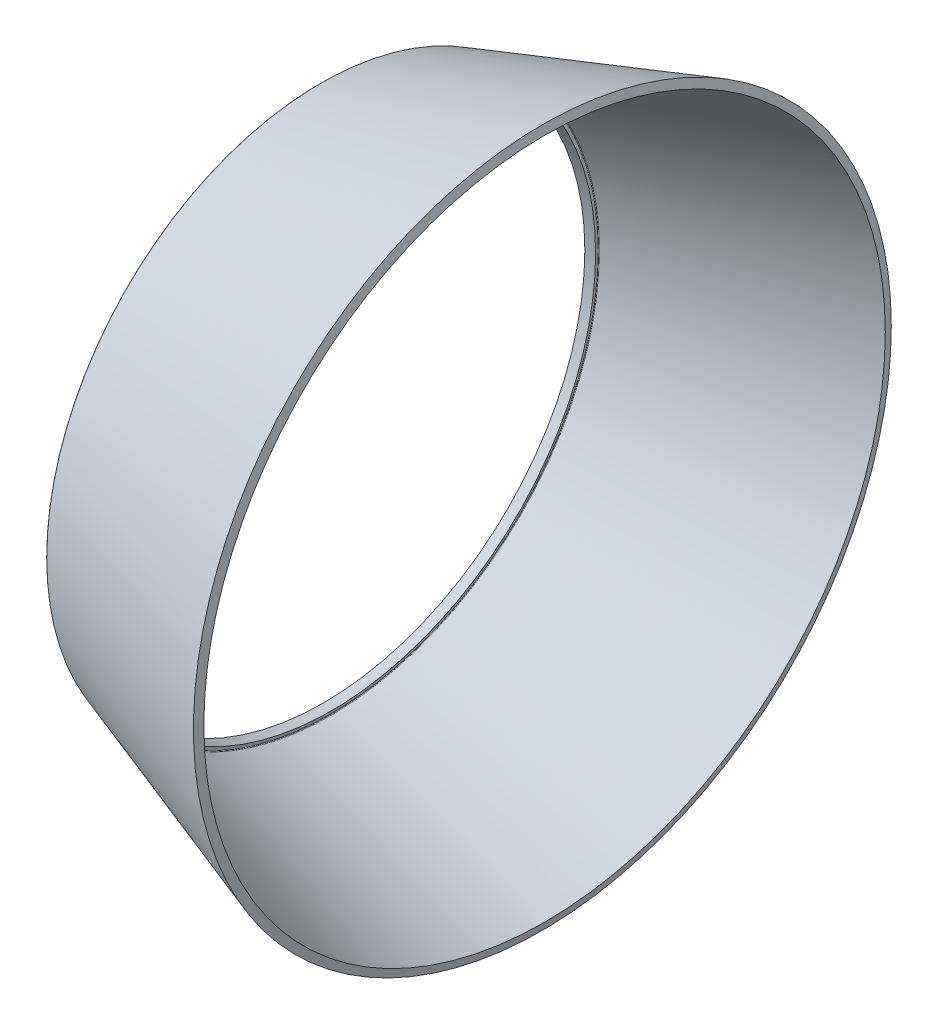
ISO-10303-21;
HEADER;
FILE_DESCRIPTION(('STEP AP214'),'2;1');
FILE_NAME('part.step','',(''),(''),'','','');
FILE_SCHEMA(('AUTOMOTIVE_DESIGN { 1 0 10303 214 1 1 1 1 }'));
ENDSEC;
DATA;
#1=APPLICATION_CONTEXT('core data for automotive mechanical design processes');
#2=APPLICATION_PROTOCOL_DEFINITION('international standard','automotive_design',2000,#1);
#3=PRODUCT_CONTEXT('',#1,'mechanical');
#4=PRODUCT('Part','Part','',(#3));
#5=PRODUCT_RELATED_PRODUCT_CATEGORY('part','',(#4));
#6=PRODUCT_DEFINITION_FORMATION('','',#4);
#7=PRODUCT_DEFINITION_CONTEXT('part definition',#1,'design');
#8=PRODUCT_DEFINITION('design','',#6,#7);
#9=PRODUCT_DEFINITION_SHAPE('','',#8);
#10=(LENGTH_UNIT() NAMED_UNIT(*) SI_UNIT(.MILLI.,.METRE.));
#11=(NAMED_UNIT(*) PLANE_ANGLE_UNIT() SI_UNIT($,.RADIAN.));
#12=(NAMED_UNIT(*) SI_UNIT($,.STERADIAN.) SOLID_ANGLE_UNIT());
#13=UNCERTAINTY_MEASURE_WITH_UNIT(LENGTH_MEASURE(1.E-05),#10,'distance_accuracy_value','');
#14=(GEOMETRIC_REPRESENTATION_CONTEXT(3) GLOBAL_UNCERTAINTY_ASSIGNED_CONTEXT((#13)) GLOBAL_UNIT_ASSIGNED_CONTEXT((#10,
#11,#12)) REPRESENTATION_CONTEXT('',''));
#15=CARTESIAN_POINT('',(0.,0.,0.));
#16=DIRECTION('',(0.,0.,1.));
#17=DIRECTION('',(1.,0.,0.));
#18=AXIS2_PLACEMENT_3D('',#15,#16,#17);
#19=CARTESIAN_POINT('',(0.397727850740168,0.,0.));
#20=DIRECTION('',(-1.,0.,0.));
#21=DIRECTION('',(0.,0.,1.));
#22=AXIS2_PLACEMENT_3D('',#19,#20,#21);
#23=CONICAL_SURFACE('',#22,15.7803513290288,1.3119116388);
#24=CARTESIAN_POINT('',(0.452294985417941,0.,0.));
#25=DIRECTION('',(1.,0.,0.));
#26=DIRECTION('',(0.,0.,-1.));
#27=AXIS2_PLACEMENT_3D('',#24,#25,#26);
#28=CIRCLE('',#27,15.5743036089333);
#29=CARTESIAN_POINT('',(0.452294985417944,0.,-15.5743036089333));
#30=VERTEX_POINT('',#29);
#31=EDGE_CURVE('E71',#30,#30,#28,.F.);
#32=ORIENTED_EDGE('',*,*,#31,.T.);
#33=EDGE_LOOP('',(#32));
#34=FACE_BOUND('',#33,.T.);
#35=CARTESIAN_POINT('',(0.39772785076896,0.,0.));
#36=DIRECTION('',(1.,0.,0.));
#37=DIRECTION('',(0.,0.,-1.));
#38=AXIS2_PLACEMENT_3D('',#35,#36,#37);
#39=CIRCLE('',#38,15.7803513290364);
#40=CARTESIAN_POINT('',(0.39772785076896,0.,-15.7803513290364));
#41=VERTEX_POINT('',#40);
#42=EDGE_CURVE('E67',#41,#41,#39,.T.);
#43=ORIENTED_EDGE('',*,*,#42,.T.);
#44=EDGE_LOOP('',(#43));
#45=FACE_BOUND('',#44,.T.);
#46=ADVANCED_FACE('F14',(#34,#45),#23,.T.);
#47=CARTESIAN_POINT('',(0.452294985417942,0.,0.));
#48=DIRECTION('',(1.,0.,0.));
#49=DIRECTION('',(0.,1.,0.));
#50=AXIS2_PLACEMENT_3D('',#47,#48,#49);
#51=CONICAL_SURFACE('',#50,15.5743036089333,0.325783158200001);
#52=CARTESIAN_POINT('',(-0.0224671782161302,0.,0.));
#53=DIRECTION('',(-1.,0.,0.));
#54=DIRECTION('',(0.,0.,1.));
#55=AXIS2_PLACEMENT_3D('',#52,#53,#54);
#56=CIRCLE('',#55,15.4139194265362);
#57=CARTESIAN_POINT('',(-0.0224671782161306,0.,15.4139194265362));
#58=VERTEX_POINT('',#57);
#59=EDGE_CURVE('E70',#58,#58,#56,.T.);
#60=ORIENTED_EDGE('',*,*,#59,.T.);
#61=EDGE_LOOP('',(#60));
#62=FACE_BOUND('',#61,.T.);
#63=ORIENTED_EDGE('',*,*,#31,.F.);
#64=EDGE_LOOP('',(#63));
#65=FACE_BOUND('',#64,.T.);
#66=ADVANCED_FACE('F60',(#62,#65),#51,.F.);
#67=CARTESIAN_POINT('',(0.436394894843203,0.,0.));
#68=DIRECTION('',(1.,0.,0.));
#69=DIRECTION('',(0.,0.,-1.));
#70=AXIS2_PLACEMENT_3D('',#67,#68,#69);
#71=TOROIDAL_SURFACE('',#70,15.7905914317,0.04);
#72=CARTESIAN_POINT('',(0.423592860921064,0.,0.));
#73=DIRECTION('',(1.,0.,0.));
#74=DIRECTION('',(0.,0.,-1.));
#75=AXIS2_PLACEMENT_3D('',#72,#73,#74);
#76=CIRCLE('',#75,15.828487446303);
#77=CARTESIAN_POINT('',(0.423592860921066,0.,-15.828487446303));
#78=VERTEX_POINT('',#77);
#79=EDGE_CURVE('E96',#78,#78,#76,.T.);
#80=ORIENTED_EDGE('',*,*,#79,.T.);
#81=EDGE_LOOP('',(#80));
#82=FACE_BOUND('',#81,.T.);
#83=ORIENTED_EDGE('',*,*,#42,.F.);
#84=EDGE_LOOP('',(#83));
#85=FACE_BOUND('',#84,.T.);
#86=ADVANCED_FACE('F56',(#82,#85),#71,.F.);
#87=CARTESIAN_POINT('',(-0.200534065341964,0.,0.));
#88=DIRECTION('',(-1.,0.,0.));
#89=DIRECTION('',(0.,-1.,0.));
#90=AXIS2_PLACEMENT_3D('',#87,#88,#89);
#91=CONICAL_SURFACE('',#90,16.0863072354631,1.3119116388);
#92=CARTESIAN_POINT('',(-0.200534065354323,0.,0.));
#93=DIRECTION('',(1.,0.,0.));
#94=DIRECTION('',(0.,0.,-1.));
#95=AXIS2_PLACEMENT_3D('',#92,#93,#94);
#96=CIRCLE('',#95,16.0863072354598);
#97=CARTESIAN_POINT('',(-0.200534065354323,0.,-16.0863072354598));
#98=VERTEX_POINT('',#97);
#99=EDGE_CURVE('E35',#98,#98,#96,.T.);
#100=ORIENTED_EDGE('',*,*,#99,.F.);
#101=EDGE_LOOP('',(#100));
#102=FACE_BOUND('',#101,.T.);
#103=ORIENTED_EDGE('',*,*,#59,.F.);
#104=EDGE_LOOP('',(#103));
#105=FACE_BOUND('',#104,.T.);
#106=ADVANCED_FACE('F52',(#102,#105),#91,.F.);
#107=CARTESIAN_POINT('',(13.0168244155687,0.,0.));
#108=DIRECTION('',(1.,0.,0.));
#109=DIRECTION('',(0.,1.,0.));
#110=AXIS2_PLACEMENT_3D('',#107,#108,#109);
#111=CONICAL_SURFACE('',#110,20.0827336807768,0.3257831582);
#112=ORIENTED_EDGE('',*,*,#79,.F.);
#113=EDGE_LOOP('',(#112));
#114=FACE_BOUND('',#113,.T.);
#115=CARTESIAN_POINT('',(13.0168244156525,0.,0.));
#116=DIRECTION('',(-1.,0.,0.));
#117=DIRECTION('',(0.,0.,1.));
#118=AXIS2_PLACEMENT_3D('',#115,#116,#117);
#119=CIRCLE('',#118,20.0827336805156);
#120=CARTESIAN_POINT('',(13.0168244156525,0.,20.0827336805156));
#121=VERTEX_POINT('',#120);
#122=EDGE_CURVE('E26',#121,#121,#119,.T.);
#123=ORIENTED_EDGE('',*,*,#122,.F.);
#124=EDGE_LOOP('',(#123));
#125=FACE_BOUND('',#124,.T.);
#126=ADVANCED_FACE('F47',(#114,#125),#111,.F.);
#127=CARTESIAN_POINT('',(-0.142533499228346,0.,0.));
#128=DIRECTION('',(1.,0.,0.));
#129=DIRECTION('',(0.,0.,-1.));
#130=AXIS2_PLACEMENT_3D('',#127,#128,#129);
#131=TOROIDAL_SURFACE('',#130,16.1016673894,0.06);
#132=CARTESIAN_POINT('',(-0.161736550018943,0.,0.));
#133=DIRECTION('',(1.,0.,0.));
#134=DIRECTION('',(0.,0.,-1.));
#135=AXIS2_PLACEMENT_3D('',#132,#133,#134);
#136=CIRCLE('',#135,16.1585114110892);
#137=CARTESIAN_POINT('',(-0.161736550018943,0.,-16.1585114110892));
#138=VERTEX_POINT('',#137);
#139=EDGE_CURVE('E21',#138,#138,#136,.T.);
#140=ORIENTED_EDGE('',*,*,#139,.F.);
#141=EDGE_LOOP('',(#140));
#142=FACE_BOUND('',#141,.T.);
#143=ORIENTED_EDGE('',*,*,#99,.T.);
#144=EDGE_LOOP('',(#143));
#145=FACE_BOUND('',#144,.T.);
#146=ADVANCED_FACE('F42',(#142,#145),#131,.T.);
#147=CARTESIAN_POINT('',(12.8885361688099,0.,0.));
#148=DIRECTION('',(-1.,0.,0.));
#149=DIRECTION('',(0.,0.,1.));
#150=AXIS2_PLACEMENT_3D('',#147,#148,#149);
#151=CONICAL_SURFACE('',#150,20.5671553189116,1.3119116388);
#152=ORIENTED_EDGE('',*,*,#122,.T.);
#153=EDGE_LOOP('',(#152));
#154=FACE_BOUND('',#153,.T.);
#155=CARTESIAN_POINT('',(12.8885361688423,0.,0.));
#156=DIRECTION('',(1.,0.,0.));
#157=DIRECTION('',(0.,0.,-1.));
#158=AXIS2_PLACEMENT_3D('',#155,#156,#157);
#159=CIRCLE('',#158,20.5671553189019);
#160=CARTESIAN_POINT('',(12.8885361688423,0.,-20.5671553189019));
#161=VERTEX_POINT('',#160);
#162=EDGE_CURVE('E10',#161,#161,#159,.F.);
#163=ORIENTED_EDGE('',*,*,#162,.F.);
#164=EDGE_LOOP('',(#163));
#165=FACE_BOUND('',#164,.T.);
#166=ADVANCED_FACE('F46',(#154,#165),#151,.T.);
#167=CARTESIAN_POINT('',(12.8885361688423,0.,0.));
#168=DIRECTION('',(1.,0.,0.));
#169=DIRECTION('',(0.,1.,0.));
#170=AXIS2_PLACEMENT_3D('',#167,#168,#169);
#171=CONICAL_SURFACE('',#170,20.5671553189019,0.3257831582);
#172=ORIENTED_EDGE('',*,*,#162,.T.);
#173=EDGE_LOOP('',(#172));
#174=FACE_BOUND('',#173,.T.);
#175=ORIENTED_EDGE('',*,*,#139,.T.);
#176=EDGE_LOOP('',(#175));
#177=FACE_BOUND('',#176,.T.);
#178=ADVANCED_FACE('F85',(#174,#177),#171,.T.);
#179=CLOSED_SHELL('',(#46,#66,#86,#106,#126,#146,#166,#178));
#180=MANIFOLD_SOLID_BREP('B1',#179);
#181=ADVANCED_BREP_SHAPE_REPRESENTATION('',(#18,#180),#14);
#182=SHAPE_DEFINITION_REPRESENTATION(#9,#181);
ENDSEC;
END-ISO-10303-21;
